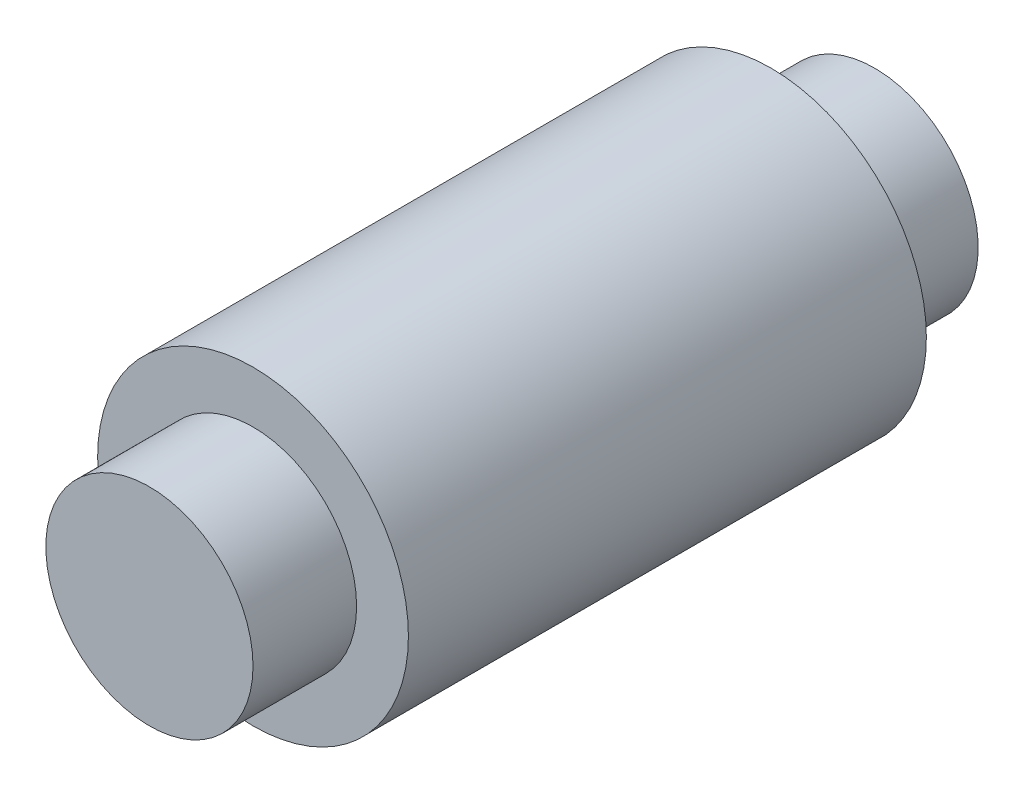
ISO-10303-21;
HEADER;
FILE_DESCRIPTION(('STEP AP214'),'2;1');
FILE_NAME('part.step','',(''),(''),'','','');
FILE_SCHEMA(('AUTOMOTIVE_DESIGN { 1 0 10303 214 1 1 1 1 }'));
ENDSEC;
DATA;
#1=APPLICATION_CONTEXT('core data for automotive mechanical design processes');
#2=APPLICATION_PROTOCOL_DEFINITION('international standard','automotive_design',2000,#1);
#3=PRODUCT_CONTEXT('',#1,'mechanical');
#4=PRODUCT('Part','Part','',(#3));
#5=PRODUCT_RELATED_PRODUCT_CATEGORY('part','',(#4));
#6=PRODUCT_DEFINITION_FORMATION('','',#4);
#7=PRODUCT_DEFINITION_CONTEXT('part definition',#1,'design');
#8=PRODUCT_DEFINITION('design','',#6,#7);
#9=PRODUCT_DEFINITION_SHAPE('','',#8);
#10=(LENGTH_UNIT() NAMED_UNIT(*) SI_UNIT(.MILLI.,.METRE.));
#11=(NAMED_UNIT(*) PLANE_ANGLE_UNIT() SI_UNIT($,.RADIAN.));
#12=(NAMED_UNIT(*) SI_UNIT($,.STERADIAN.) SOLID_ANGLE_UNIT());
#13=UNCERTAINTY_MEASURE_WITH_UNIT(LENGTH_MEASURE(1.E-05),#10,'distance_accuracy_value','');
#14=(GEOMETRIC_REPRESENTATION_CONTEXT(3) GLOBAL_UNCERTAINTY_ASSIGNED_CONTEXT((#13)) GLOBAL_UNIT_ASSIGNED_CONTEXT((#10,
#11,#12)) REPRESENTATION_CONTEXT('',''));
#15=CARTESIAN_POINT('',(0.,0.,0.));
#16=DIRECTION('',(0.,0.,1.));
#17=DIRECTION('',(1.,0.,0.));
#18=AXIS2_PLACEMENT_3D('',#15,#16,#17);
#19=CARTESIAN_POINT('',(0.,0.,500.));
#20=DIRECTION('',(0.,0.,-1.));
#21=DIRECTION('',(-1.,0.,0.));
#22=AXIS2_PLACEMENT_3D('',#19,#20,#21);
#23=CYLINDRICAL_SURFACE('',#22,150.);
#24=CARTESIAN_POINT('',(0.,0.,500.));
#25=DIRECTION('',(0.,0.,1.));
#26=DIRECTION('',(1.,0.,0.));
#27=AXIS2_PLACEMENT_3D('',#24,#25,#26);
#28=CIRCLE('',#27,150.);
#29=CARTESIAN_POINT('',(150.,0.,500.));
#30=VERTEX_POINT('',#29);
#31=EDGE_CURVE('E43',#30,#30,#28,.T.);
#32=ORIENTED_EDGE('',*,*,#31,.F.);
#33=EDGE_LOOP('',(#32));
#34=FACE_BOUND('',#33,.T.);
#35=CARTESIAN_POINT('',(0.,0.,0.));
#36=DIRECTION('',(0.,0.,1.));
#37=DIRECTION('',(1.,0.,0.));
#38=AXIS2_PLACEMENT_3D('',#35,#36,#37);
#39=CIRCLE('',#38,150.);
#40=CARTESIAN_POINT('',(150.,0.,0.));
#41=VERTEX_POINT('',#40);
#42=EDGE_CURVE('E34',#41,#41,#39,.T.);
#43=ORIENTED_EDGE('',*,*,#42,.T.);
#44=EDGE_LOOP('',(#43));
#45=FACE_BOUND('',#44,.T.);
#46=ADVANCED_FACE('F31',(#34,#45),#23,.T.);
#47=CARTESIAN_POINT('',(0.,0.,500.));
#48=DIRECTION('',(0.,0.,1.));
#49=DIRECTION('',(1.,0.,0.));
#50=AXIS2_PLACEMENT_3D('',#47,#48,#49);
#51=PLANE('',#50);
#52=CARTESIAN_POINT('',(0.,0.,500.));
#53=DIRECTION('',(0.,0.,1.));
#54=DIRECTION('',(1.,0.,0.));
#55=AXIS2_PLACEMENT_3D('',#52,#53,#54);
#56=CIRCLE('',#55,100.);
#57=CARTESIAN_POINT('',(100.,0.,500.));
#58=VERTEX_POINT('',#57);
#59=EDGE_CURVE('E38',#58,#58,#56,.T.);
#60=ORIENTED_EDGE('',*,*,#59,.F.);
#61=EDGE_LOOP('',(#60));
#62=FACE_BOUND('',#61,.T.);
#63=ORIENTED_EDGE('',*,*,#31,.T.);
#64=EDGE_LOOP('',(#63));
#65=FACE_BOUND('',#64,.T.);
#66=ADVANCED_FACE('F60',(#62,#65),#51,.T.);
#67=CARTESIAN_POINT('',(0.,0.,0.));
#68=DIRECTION('',(0.,0.,1.));
#69=DIRECTION('',(1.,0.,0.));
#70=AXIS2_PLACEMENT_3D('',#67,#68,#69);
#71=PLANE('',#70);
#72=CARTESIAN_POINT('',(0.,0.,0.));
#73=DIRECTION('',(0.,0.,-1.));
#74=DIRECTION('',(-1.,0.,0.));
#75=AXIS2_PLACEMENT_3D('',#72,#73,#74);
#76=CIRCLE('',#75,100.);
#77=CARTESIAN_POINT('',(-100.,0.,0.));
#78=VERTEX_POINT('',#77);
#79=EDGE_CURVE('E10',#78,#78,#76,.T.);
#80=ORIENTED_EDGE('',*,*,#79,.F.);
#81=EDGE_LOOP('',(#80));
#82=FACE_BOUND('',#81,.T.);
#83=ORIENTED_EDGE('',*,*,#42,.F.);
#84=EDGE_LOOP('',(#83));
#85=FACE_BOUND('',#84,.T.);
#86=ADVANCED_FACE('F57',(#82,#85),#71,.F.);
#87=CARTESIAN_POINT('',(0.,0.,600.));
#88=DIRECTION('',(0.,0.,-1.));
#89=DIRECTION('',(-1.,0.,0.));
#90=AXIS2_PLACEMENT_3D('',#87,#88,#89);
#91=CYLINDRICAL_SURFACE('',#90,100.);
#92=CARTESIAN_POINT('',(0.,0.,600.));
#93=DIRECTION('',(0.,0.,1.));
#94=DIRECTION('',(1.,0.,0.));
#95=AXIS2_PLACEMENT_3D('',#92,#93,#94);
#96=CIRCLE('',#95,100.);
#97=CARTESIAN_POINT('',(100.,0.,600.));
#98=VERTEX_POINT('',#97);
#99=EDGE_CURVE('E48',#98,#98,#96,.T.);
#100=ORIENTED_EDGE('',*,*,#99,.F.);
#101=EDGE_LOOP('',(#100));
#102=FACE_BOUND('',#101,.T.);
#103=ORIENTED_EDGE('',*,*,#59,.T.);
#104=EDGE_LOOP('',(#103));
#105=FACE_BOUND('',#104,.T.);
#106=ADVANCED_FACE('F59',(#102,#105),#91,.T.);
#107=CARTESIAN_POINT('',(0.,0.,600.));
#108=DIRECTION('',(0.,0.,1.));
#109=DIRECTION('',(1.,0.,0.));
#110=AXIS2_PLACEMENT_3D('',#107,#108,#109);
#111=PLANE('',#110);
#112=ORIENTED_EDGE('',*,*,#99,.T.);
#113=EDGE_LOOP('',(#112));
#114=FACE_BOUND('',#113,.T.);
#115=ADVANCED_FACE('F66',(#114),#111,.T.);
#116=CARTESIAN_POINT('',(0.,0.,-100.));
#117=DIRECTION('',(0.,0.,1.));
#118=DIRECTION('',(1.,0.,0.));
#119=AXIS2_PLACEMENT_3D('',#116,#117,#118);
#120=CYLINDRICAL_SURFACE('',#119,100.);
#121=CARTESIAN_POINT('',(0.,0.,-100.));
#122=DIRECTION('',(0.,0.,-1.));
#123=DIRECTION('',(-1.,0.,0.));
#124=AXIS2_PLACEMENT_3D('',#121,#122,#123);
#125=CIRCLE('',#124,100.);
#126=CARTESIAN_POINT('',(-100.,0.,-100.));
#127=VERTEX_POINT('',#126);
#128=EDGE_CURVE('E47',#127,#127,#125,.T.);
#129=ORIENTED_EDGE('',*,*,#128,.F.);
#130=EDGE_LOOP('',(#129));
#131=FACE_BOUND('',#130,.T.);
#132=ORIENTED_EDGE('',*,*,#79,.T.);
#133=EDGE_LOOP('',(#132));
#134=FACE_BOUND('',#133,.T.);
#135=ADVANCED_FACE('F94',(#131,#134),#120,.T.);
#136=CARTESIAN_POINT('',(0.,0.,-100.));
#137=DIRECTION('',(0.,0.,-1.));
#138=DIRECTION('',(-1.,0.,0.));
#139=AXIS2_PLACEMENT_3D('',#136,#137,#138);
#140=PLANE('',#139);
#141=ORIENTED_EDGE('',*,*,#128,.T.);
#142=EDGE_LOOP('',(#141));
#143=FACE_BOUND('',#142,.T.);
#144=ADVANCED_FACE('F108',(#143),#140,.T.);
#145=CLOSED_SHELL('',(#46,#66,#86,#106,#115,#135,#144));
#146=MANIFOLD_SOLID_BREP('B2',#145);
#147=ADVANCED_BREP_SHAPE_REPRESENTATION('',(#18,#146),#14);
#148=SHAPE_DEFINITION_REPRESENTATION(#9,#147);
ENDSEC;
END-ISO-10303-21;
